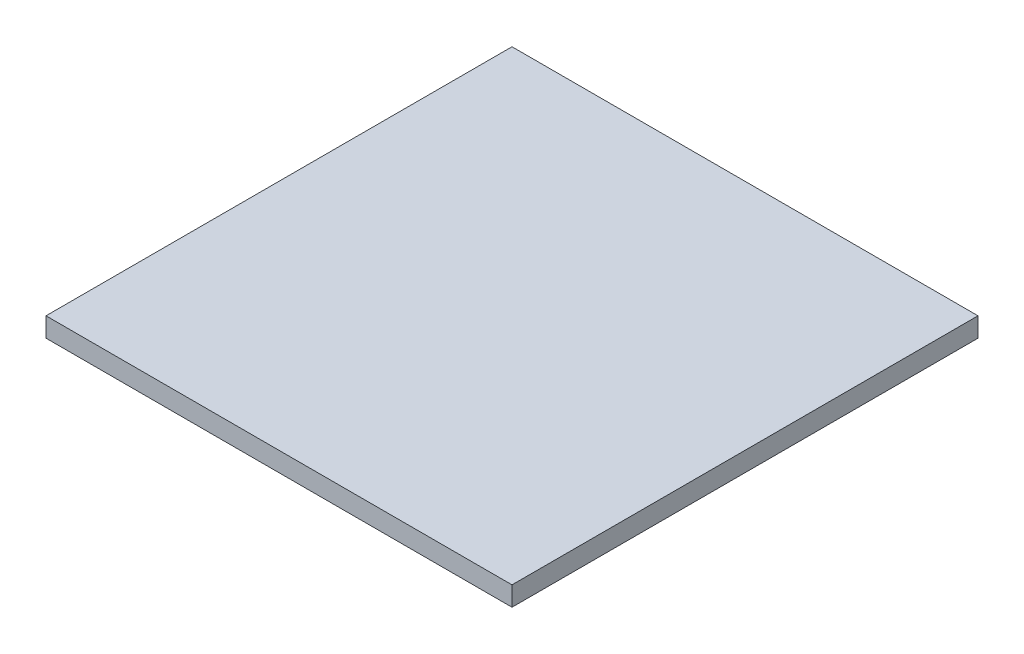
ISO-10303-21;
HEADER;
FILE_DESCRIPTION(('STEP AP214'),'2;1');
FILE_NAME('part.step','',(''),(''),'','','');
FILE_SCHEMA(('AUTOMOTIVE_DESIGN { 1 0 10303 214 1 1 1 1 }'));
ENDSEC;
DATA;
#1=APPLICATION_CONTEXT('core data for automotive mechanical design processes');
#2=APPLICATION_PROTOCOL_DEFINITION('international standard','automotive_design',2000,#1);
#3=PRODUCT_CONTEXT('',#1,'mechanical');
#4=PRODUCT('Part','Part','',(#3));
#5=PRODUCT_RELATED_PRODUCT_CATEGORY('part','',(#4));
#6=PRODUCT_DEFINITION_FORMATION('','',#4);
#7=PRODUCT_DEFINITION_CONTEXT('part definition',#1,'design');
#8=PRODUCT_DEFINITION('design','',#6,#7);
#9=PRODUCT_DEFINITION_SHAPE('','',#8);
#10=(LENGTH_UNIT() NAMED_UNIT(*) SI_UNIT(.MILLI.,.METRE.));
#11=(NAMED_UNIT(*) PLANE_ANGLE_UNIT() SI_UNIT($,.RADIAN.));
#12=(NAMED_UNIT(*) SI_UNIT($,.STERADIAN.) SOLID_ANGLE_UNIT());
#13=UNCERTAINTY_MEASURE_WITH_UNIT(LENGTH_MEASURE(1.E-05),#10,'distance_accuracy_value','');
#14=(GEOMETRIC_REPRESENTATION_CONTEXT(3) GLOBAL_UNCERTAINTY_ASSIGNED_CONTEXT((#13)) GLOBAL_UNIT_ASSIGNED_CONTEXT((#10,
#11,#12)) REPRESENTATION_CONTEXT('',''));
#15=CARTESIAN_POINT('',(0.,0.,0.));
#16=DIRECTION('',(0.,0.,1.));
#17=DIRECTION('',(1.,0.,0.));
#18=AXIS2_PLACEMENT_3D('',#15,#16,#17);
#19=CARTESIAN_POINT('',(-6.,0.5,6.));
#20=DIRECTION('',(1.,0.,0.));
#21=DIRECTION('',(0.,0.,-1.));
#22=AXIS2_PLACEMENT_3D('',#19,#20,#21);
#23=PLANE('',#22);
#24=DIRECTION('',(0.,0.,1.));
#25=VECTOR('',#24,1.);
#26=CARTESIAN_POINT('',(-6.,0.,6.));
#27=LINE('',#26,#25);
#28=CARTESIAN_POINT('',(-6.,0.,-6.));
#29=VERTEX_POINT('',#28);
#30=CARTESIAN_POINT('',(-6.,0.,6.));
#31=VERTEX_POINT('',#30);
#32=EDGE_CURVE('E96',#29,#31,#27,.T.);
#33=ORIENTED_EDGE('',*,*,#32,.T.);
#34=DIRECTION('',(0.,-1.,0.));
#35=VECTOR('',#34,1.);
#36=CARTESIAN_POINT('',(-6.,0.5,6.));
#37=LINE('',#36,#35);
#38=CARTESIAN_POINT('',(-6.,0.5,6.));
#39=VERTEX_POINT('',#38);
#40=EDGE_CURVE('E11',#39,#31,#37,.T.);
#41=ORIENTED_EDGE('',*,*,#40,.F.);
#42=DIRECTION('',(0.,0.,1.));
#43=VECTOR('',#42,1.);
#44=CARTESIAN_POINT('',(-6.,0.5,6.));
#45=LINE('',#44,#43);
#46=CARTESIAN_POINT('',(-6.,0.5,-6.));
#47=VERTEX_POINT('',#46);
#48=EDGE_CURVE('E84',#47,#39,#45,.T.);
#49=ORIENTED_EDGE('',*,*,#48,.F.);
#50=DIRECTION('',(0.,-1.,0.));
#51=VECTOR('',#50,1.);
#52=CARTESIAN_POINT('',(-6.,0.5,-6.));
#53=LINE('',#52,#51);
#54=EDGE_CURVE('E92',#47,#29,#53,.T.);
#55=ORIENTED_EDGE('',*,*,#54,.T.);
#56=EDGE_LOOP('',(#33,#41,#49,#55));
#57=FACE_BOUND('',#56,.T.);
#58=ADVANCED_FACE('F33',(#57),#23,.F.);
#59=CARTESIAN_POINT('',(6.,0.5,6.));
#60=DIRECTION('',(0.,0.,-1.));
#61=DIRECTION('',(-1.,0.,0.));
#62=AXIS2_PLACEMENT_3D('',#59,#60,#61);
#63=PLANE('',#62);
#64=DIRECTION('',(1.,0.,0.));
#65=VECTOR('',#64,1.);
#66=CARTESIAN_POINT('',(6.,0.,6.));
#67=LINE('',#66,#65);
#68=CARTESIAN_POINT('',(6.,0.,6.));
#69=VERTEX_POINT('',#68);
#70=EDGE_CURVE('E88',#31,#69,#67,.T.);
#71=ORIENTED_EDGE('',*,*,#70,.T.);
#72=DIRECTION('',(0.,-1.,0.));
#73=VECTOR('',#72,1.);
#74=CARTESIAN_POINT('',(6.,0.5,6.));
#75=LINE('',#74,#73);
#76=CARTESIAN_POINT('',(6.,0.5,6.));
#77=VERTEX_POINT('',#76);
#78=EDGE_CURVE('E41',#77,#69,#75,.T.);
#79=ORIENTED_EDGE('',*,*,#78,.F.);
#80=DIRECTION('',(1.,0.,0.));
#81=VECTOR('',#80,1.);
#82=CARTESIAN_POINT('',(6.,0.5,6.));
#83=LINE('',#82,#81);
#84=EDGE_CURVE('E79',#39,#77,#83,.T.);
#85=ORIENTED_EDGE('',*,*,#84,.F.);
#86=ORIENTED_EDGE('',*,*,#40,.T.);
#87=EDGE_LOOP('',(#71,#79,#85,#86));
#88=FACE_BOUND('',#87,.T.);
#89=ADVANCED_FACE('F87',(#88),#63,.F.);
#90=CARTESIAN_POINT('',(6.,0.5,6.));
#91=DIRECTION('',(-1.,0.,0.));
#92=DIRECTION('',(0.,0.,1.));
#93=AXIS2_PLACEMENT_3D('',#90,#91,#92);
#94=PLANE('',#93);
#95=DIRECTION('',(0.,0.,-1.));
#96=VECTOR('',#95,1.);
#97=CARTESIAN_POINT('',(6.,0.,6.));
#98=LINE('',#97,#96);
#99=CARTESIAN_POINT('',(6.,0.,-6.));
#100=VERTEX_POINT('',#99);
#101=EDGE_CURVE('E66',#69,#100,#98,.T.);
#102=ORIENTED_EDGE('',*,*,#101,.T.);
#103=DIRECTION('',(0.,-1.,0.));
#104=VECTOR('',#103,1.);
#105=CARTESIAN_POINT('',(6.,0.5,-6.));
#106=LINE('',#105,#104);
#107=CARTESIAN_POINT('',(6.,0.5,-6.));
#108=VERTEX_POINT('',#107);
#109=EDGE_CURVE('E89',#108,#100,#106,.T.);
#110=ORIENTED_EDGE('',*,*,#109,.F.);
#111=DIRECTION('',(0.,0.,-1.));
#112=VECTOR('',#111,1.);
#113=CARTESIAN_POINT('',(6.,0.5,6.));
#114=LINE('',#113,#112);
#115=EDGE_CURVE('E82',#77,#108,#114,.T.);
#116=ORIENTED_EDGE('',*,*,#115,.F.);
#117=ORIENTED_EDGE('',*,*,#78,.T.);
#118=EDGE_LOOP('',(#102,#110,#116,#117));
#119=FACE_BOUND('',#118,.T.);
#120=ADVANCED_FACE('F90',(#119),#94,.F.);
#121=CARTESIAN_POINT('',(6.,0.5,-6.));
#122=DIRECTION('',(0.,0.,1.));
#123=DIRECTION('',(1.,0.,0.));
#124=AXIS2_PLACEMENT_3D('',#121,#122,#123);
#125=PLANE('',#124);
#126=DIRECTION('',(-1.,0.,0.));
#127=VECTOR('',#126,1.);
#128=CARTESIAN_POINT('',(6.,0.,-6.));
#129=LINE('',#128,#127);
#130=EDGE_CURVE('E72',#100,#29,#129,.T.);
#131=ORIENTED_EDGE('',*,*,#130,.T.);
#132=ORIENTED_EDGE('',*,*,#54,.F.);
#133=DIRECTION('',(-1.,0.,0.));
#134=VECTOR('',#133,1.);
#135=CARTESIAN_POINT('',(6.,0.5,-6.));
#136=LINE('',#135,#134);
#137=EDGE_CURVE('E49',#108,#47,#136,.T.);
#138=ORIENTED_EDGE('',*,*,#137,.F.);
#139=ORIENTED_EDGE('',*,*,#109,.T.);
#140=EDGE_LOOP('',(#131,#132,#138,#139));
#141=FACE_BOUND('',#140,.T.);
#142=ADVANCED_FACE('F103',(#141),#125,.F.);
#143=CARTESIAN_POINT('',(0.,0.5,0.));
#144=DIRECTION('',(0.,1.,0.));
#145=DIRECTION('',(0.,0.,1.));
#146=AXIS2_PLACEMENT_3D('',#143,#144,#145);
#147=PLANE('',#146);
#148=ORIENTED_EDGE('',*,*,#48,.T.);
#149=ORIENTED_EDGE('',*,*,#84,.T.);
#150=ORIENTED_EDGE('',*,*,#115,.T.);
#151=ORIENTED_EDGE('',*,*,#137,.T.);
#152=EDGE_LOOP('',(#148,#149,#150,#151));
#153=FACE_BOUND('',#152,.T.);
#154=ADVANCED_FACE('F80',(#153),#147,.T.);
#155=CARTESIAN_POINT('',(0.,0.,0.));
#156=DIRECTION('',(0.,1.,0.));
#157=DIRECTION('',(0.,0.,1.));
#158=AXIS2_PLACEMENT_3D('',#155,#156,#157);
#159=PLANE('',#158);
#160=ORIENTED_EDGE('',*,*,#32,.F.);
#161=ORIENTED_EDGE('',*,*,#130,.F.);
#162=ORIENTED_EDGE('',*,*,#101,.F.);
#163=ORIENTED_EDGE('',*,*,#70,.F.);
#164=EDGE_LOOP('',(#160,#161,#162,#163));
#165=FACE_BOUND('',#164,.T.);
#166=ADVANCED_FACE('F106',(#165),#159,.F.);
#167=CLOSED_SHELL('',(#58,#89,#120,#142,#154,#166));
#168=MANIFOLD_SOLID_BREP('B2',#167);
#169=ADVANCED_BREP_SHAPE_REPRESENTATION('',(#18,#168),#14);
#170=SHAPE_DEFINITION_REPRESENTATION(#9,#169);
ENDSEC;
END-ISO-10303-21;
